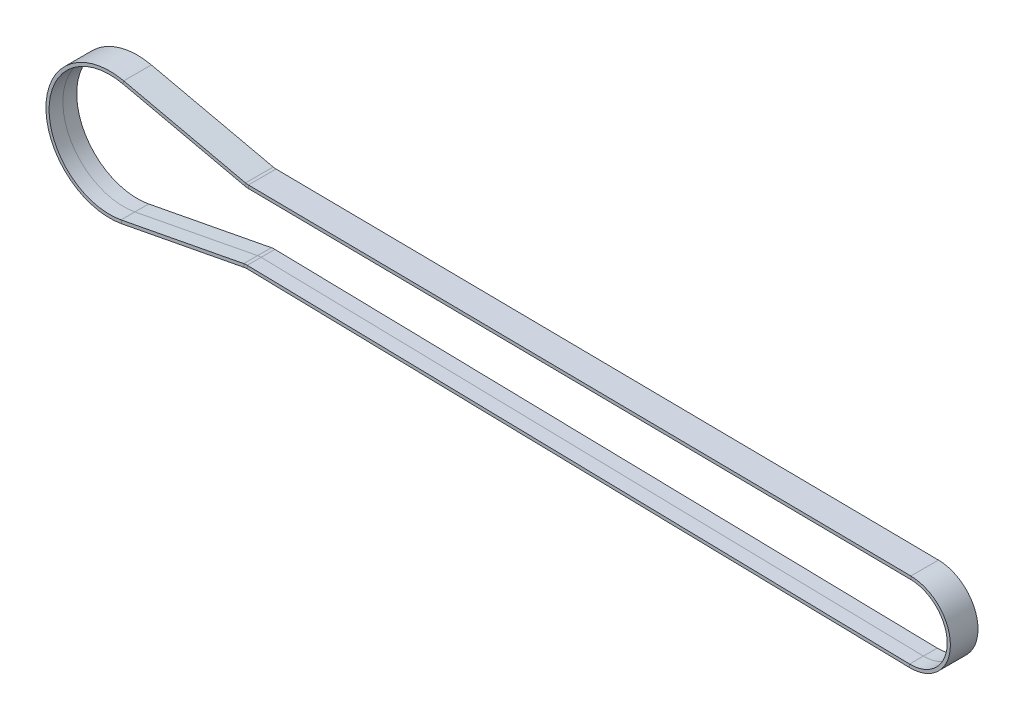
ISO-10303-21;
HEADER;
FILE_DESCRIPTION(('STEP AP214'),'2;1');
FILE_NAME('part.step','',(''),(''),'','','');
FILE_SCHEMA(('AUTOMOTIVE_DESIGN { 1 0 10303 214 1 1 1 1 }'));
ENDSEC;
DATA;
#1=APPLICATION_CONTEXT('core data for automotive mechanical design processes');
#2=APPLICATION_PROTOCOL_DEFINITION('international standard','automotive_design',2000,#1);
#3=PRODUCT_CONTEXT('',#1,'mechanical');
#4=PRODUCT('Part','Part','',(#3));
#5=PRODUCT_RELATED_PRODUCT_CATEGORY('part','',(#4));
#6=PRODUCT_DEFINITION_FORMATION('','',#4);
#7=PRODUCT_DEFINITION_CONTEXT('part definition',#1,'design');
#8=PRODUCT_DEFINITION('design','',#6,#7);
#9=PRODUCT_DEFINITION_SHAPE('','',#8);
#10=(LENGTH_UNIT() NAMED_UNIT(*) SI_UNIT(.MILLI.,.METRE.));
#11=(NAMED_UNIT(*) PLANE_ANGLE_UNIT() SI_UNIT($,.RADIAN.));
#12=(NAMED_UNIT(*) SI_UNIT($,.STERADIAN.) SOLID_ANGLE_UNIT());
#13=UNCERTAINTY_MEASURE_WITH_UNIT(LENGTH_MEASURE(1.E-05),#10,'distance_accuracy_value','');
#14=(GEOMETRIC_REPRESENTATION_CONTEXT(3) GLOBAL_UNCERTAINTY_ASSIGNED_CONTEXT((#13)) GLOBAL_UNIT_ASSIGNED_CONTEXT((#10,
#11,#12)) REPRESENTATION_CONTEXT('',''));
#15=CARTESIAN_POINT('',(0.,0.,0.));
#16=DIRECTION('',(0.,0.,1.));
#17=DIRECTION('',(1.,0.,0.));
#18=AXIS2_PLACEMENT_3D('',#15,#16,#17);
#19=CARTESIAN_POINT('',(-50.2901681021654,-17.3821457503261,0.));
#20=DIRECTION('',(0.,0.,-1.));
#21=DIRECTION('',(-1.,0.,0.));
#22=AXIS2_PLACEMENT_3D('',#19,#20,#21);
#23=CYLINDRICAL_SURFACE('',#22,21.95);
#24=DIRECTION('',(0.,0.,1.));
#25=VECTOR('',#24,1.);
#26=CARTESIAN_POINT('',(-46.1621101258883,-38.9404767929763,-5.));
#27=LINE('',#26,#25);
#28=CARTESIAN_POINT('',(-46.1621101258883,-38.9404767929763,-5.));
#29=VERTEX_POINT('',#28);
#30=CARTESIAN_POINT('',(-46.1621101258883,-38.9404767929763,0.));
#31=VERTEX_POINT('',#30);
#32=EDGE_CURVE('E242',#29,#31,#27,.T.);
#33=ORIENTED_EDGE('',*,*,#32,.F.);
#34=CARTESIAN_POINT('',(-50.2901681021654,-17.3821457503261,-5.));
#35=DIRECTION('',(0.,0.,-1.));
#36=DIRECTION('',(0.188066422609435,-0.98215631173805,0.));
#37=AXIS2_PLACEMENT_3D('',#34,#35,#36);
#38=CIRCLE('',#37,21.95);
#39=CARTESIAN_POINT('',(-45.4612239283416,4.03008902715783,-5.));
#40=VERTEX_POINT('',#39);
#41=EDGE_CURVE('E241',#29,#40,#38,.T.);
#42=ORIENTED_EDGE('',*,*,#41,.T.);
#43=DIRECTION('',(0.,0.,1.));
#44=VECTOR('',#43,1.);
#45=CARTESIAN_POINT('',(-45.4612239283416,4.03008902715783,-5.));
#46=LINE('',#45,#44);
#47=CARTESIAN_POINT('',(-45.4612239283416,4.03008902715783,0.));
#48=VERTEX_POINT('',#47);
#49=EDGE_CURVE('E216',#40,#48,#46,.T.);
#50=ORIENTED_EDGE('',*,*,#49,.T.);
#51=CARTESIAN_POINT('',(-50.2901681021654,-17.3821457503261,0.));
#52=DIRECTION('',(0.,0.,-1.));
#53=DIRECTION('',(0.188066422609435,-0.98215631173805,0.));
#54=AXIS2_PLACEMENT_3D('',#51,#52,#53);
#55=CIRCLE('',#54,21.95);
#56=EDGE_CURVE('E246',#31,#48,#55,.T.);
#57=ORIENTED_EDGE('',*,*,#56,.F.);
#58=EDGE_LOOP('',(#33,#42,#50,#57));
#59=FACE_BOUND('',#58,.T.);
#60=ADVANCED_FACE('F32',(#59),#23,.F.);
#61=CARTESIAN_POINT('',(-45.4612239283416,4.03008902715783,-5.));
#62=DIRECTION('',(0.219997456666234,0.97550044544346,0.));
#63=DIRECTION('',(-0.97550044544346,0.219997456666234,0.));
#64=AXIS2_PLACEMENT_3D('',#61,#62,#63);
#65=PLANE('',#64);
#66=DIRECTION('',(0.97550044544346,-0.219997456666234,0.));
#67=VECTOR('',#66,1.);
#68=CARTESIAN_POINT('',(-45.4612239283416,4.03008902715783,0.));
#69=LINE('',#68,#67);
#70=CARTESIAN_POINT('',(-1.33538456196405,-5.92128770384181,0.));
#71=VERTEX_POINT('',#70);
#72=EDGE_CURVE('E222',#48,#71,#69,.T.);
#73=ORIENTED_EDGE('',*,*,#72,.F.);
#74=ORIENTED_EDGE('',*,*,#49,.F.);
#75=DIRECTION('',(0.97550044544346,-0.219997456666234,0.));
#76=VECTOR('',#75,1.);
#77=CARTESIAN_POINT('',(-45.4612239283416,4.03008902715783,-5.));
#78=LINE('',#77,#76);
#79=CARTESIAN_POINT('',(-1.33538456196405,-5.92128770384181,-5.));
#80=VERTEX_POINT('',#79);
#81=EDGE_CURVE('E220',#40,#80,#78,.T.);
#82=ORIENTED_EDGE('',*,*,#81,.T.);
#83=DIRECTION('',(0.,0.,1.));
#84=VECTOR('',#83,1.);
#85=CARTESIAN_POINT('',(-1.33538456196405,-5.92128770384181,-5.));
#86=LINE('',#85,#84);
#87=EDGE_CURVE('E238',#80,#71,#86,.T.);
#88=ORIENTED_EDGE('',*,*,#87,.T.);
#89=EDGE_LOOP('',(#73,#74,#82,#88));
#90=FACE_BOUND('',#89,.T.);
#91=ADVANCED_FACE('F218',(#90),#65,.F.);
#92=CARTESIAN_POINT('',(-45.4612239283416,4.03008902715783,0.));
#93=DIRECTION('',(0.219997456666234,0.97550044544346,0.));
#94=DIRECTION('',(-0.97550044544346,0.219997456666234,0.));
#95=AXIS2_PLACEMENT_3D('',#92,#93,#94);
#96=PLANE('',#95);
#97=DIRECTION('',(0.97550044544346,-0.219997456666234,0.));
#98=VECTOR('',#97,1.);
#99=CARTESIAN_POINT('',(-45.4612239283416,4.03008902715783,5.));
#100=LINE('',#99,#98);
#101=CARTESIAN_POINT('',(-45.4612239283416,4.03008902715783,5.));
#102=VERTEX_POINT('',#101);
#103=CARTESIAN_POINT('',(-1.33538456196405,-5.92128770384181,5.));
#104=VERTEX_POINT('',#103);
#105=EDGE_CURVE('E357',#102,#104,#100,.T.);
#106=ORIENTED_EDGE('',*,*,#105,.F.);
#107=DIRECTION('',(0.,0.,1.));
#108=VECTOR('',#107,1.);
#109=CARTESIAN_POINT('',(-45.4612239283416,4.03008902715783,0.));
#110=LINE('',#109,#108);
#111=EDGE_CURVE('E227',#48,#102,#110,.T.);
#112=ORIENTED_EDGE('',*,*,#111,.F.);
#113=ORIENTED_EDGE('',*,*,#72,.T.);
#114=DIRECTION('',(0.,0.,1.));
#115=VECTOR('',#114,1.);
#116=CARTESIAN_POINT('',(-1.33538456196405,-5.92128770384181,0.));
#117=LINE('',#116,#115);
#118=EDGE_CURVE('E431',#71,#104,#117,.T.);
#119=ORIENTED_EDGE('',*,*,#118,.T.);
#120=EDGE_LOOP('',(#106,#112,#113,#119));
#121=FACE_BOUND('',#120,.T.);
#122=ADVANCED_FACE('F503',(#121),#96,.F.);
#123=CARTESIAN_POINT('',(-45.4612239283416,4.03008902715783,5.));
#124=DIRECTION('',(0.,0.,-1.));
#125=DIRECTION('',(-1.,0.,0.));
#126=AXIS2_PLACEMENT_3D('',#123,#124,#125);
#127=PLANE('',#126);
#128=DIRECTION('',(0.97550044544346,-0.219997456666234,0.));
#129=VECTOR('',#128,1.);
#130=CARTESIAN_POINT('',(-45.2104268277421,5.14215953496337,5.));
#131=LINE('',#130,#129);
#132=CARTESIAN_POINT('',(-45.2104268277421,5.14215953496337,5.));
#133=VERTEX_POINT('',#132);
#134=CARTESIAN_POINT('',(-1.08458746136455,-4.80921719603627,5.));
#135=VERTEX_POINT('',#134);
#136=EDGE_CURVE('E299',#133,#135,#131,.T.);
#137=ORIENTED_EDGE('',*,*,#136,.F.);
#138=DIRECTION('',(0.219997456666232,0.97550044544346,0.));
#139=VECTOR('',#138,1.);
#140=CARTESIAN_POINT('',(-45.4612239283416,4.03008902715783,5.));
#141=LINE('',#140,#139);
#142=EDGE_CURVE('E252',#102,#133,#141,.T.);
#143=ORIENTED_EDGE('',*,*,#142,.F.);
#144=ORIENTED_EDGE('',*,*,#105,.T.);
#145=DIRECTION('',(0.219997456666232,0.97550044544346,0.));
#146=VECTOR('',#145,1.);
#147=CARTESIAN_POINT('',(-1.33538456196405,-5.92128770384181,5.));
#148=LINE('',#147,#146);
#149=EDGE_CURVE('E355',#104,#135,#148,.T.);
#150=ORIENTED_EDGE('',*,*,#149,.T.);
#151=EDGE_LOOP('',(#137,#143,#144,#150));
#152=FACE_BOUND('',#151,.T.);
#153=ADVANCED_FACE('F510',(#152),#127,.F.);
#154=CARTESIAN_POINT('',(-45.2104268277421,5.14215953496337,5.));
#155=DIRECTION('',(-0.219997456666234,-0.97550044544346,0.));
#156=DIRECTION('',(0.97550044544346,-0.219997456666234,0.));
#157=AXIS2_PLACEMENT_3D('',#154,#155,#156);
#158=PLANE('',#157);
#159=DIRECTION('',(0.97550044544346,-0.219997456666234,0.));
#160=VECTOR('',#159,1.);
#161=CARTESIAN_POINT('',(-45.2104268277421,5.14215953496337,-5.));
#162=LINE('',#161,#160);
#163=CARTESIAN_POINT('',(-45.2104268277421,5.14215953496337,-5.));
#164=VERTEX_POINT('',#163);
#165=CARTESIAN_POINT('',(-1.08458746136455,-4.80921719603627,-5.));
#166=VERTEX_POINT('',#165);
#167=EDGE_CURVE('E258',#164,#166,#162,.T.);
#168=ORIENTED_EDGE('',*,*,#167,.F.);
#169=DIRECTION('',(0.,0.,-1.));
#170=VECTOR('',#169,1.);
#171=CARTESIAN_POINT('',(-45.2104268277421,5.14215953496337,5.));
#172=LINE('',#171,#170);
#173=EDGE_CURVE('E249',#133,#164,#172,.T.);
#174=ORIENTED_EDGE('',*,*,#173,.F.);
#175=ORIENTED_EDGE('',*,*,#136,.T.);
#176=DIRECTION('',(0.,0.,-1.));
#177=VECTOR('',#176,1.);
#178=CARTESIAN_POINT('',(-1.08458746136455,-4.80921719603627,5.));
#179=LINE('',#178,#177);
#180=EDGE_CURVE('E302',#135,#166,#179,.T.);
#181=ORIENTED_EDGE('',*,*,#180,.T.);
#182=EDGE_LOOP('',(#168,#174,#175,#181));
#183=FACE_BOUND('',#182,.T.);
#184=ADVANCED_FACE('F297',(#183),#158,.F.);
#185=CARTESIAN_POINT('',(-45.2104268277421,5.14215953496337,-5.));
#186=DIRECTION('',(0.,0.,1.));
#187=DIRECTION('',(1.,0.,0.));
#188=AXIS2_PLACEMENT_3D('',#185,#186,#187);
#189=PLANE('',#188);
#190=DIRECTION('',(-0.219997456666233,-0.97550044544346,0.));
#191=VECTOR('',#190,1.);
#192=CARTESIAN_POINT('',(-1.08458746136455,-4.80921719603627,-5.));
#193=LINE('',#192,#191);
#194=EDGE_CURVE('E236',#166,#80,#193,.T.);
#195=ORIENTED_EDGE('',*,*,#194,.T.);
#196=ORIENTED_EDGE('',*,*,#81,.F.);
#197=DIRECTION('',(-0.219997456666233,-0.97550044544346,0.));
#198=VECTOR('',#197,1.);
#199=CARTESIAN_POINT('',(-45.2104268277421,5.14215953496337,-5.));
#200=LINE('',#199,#198);
#201=EDGE_CURVE('E234',#164,#40,#200,.T.);
#202=ORIENTED_EDGE('',*,*,#201,.F.);
#203=ORIENTED_EDGE('',*,*,#167,.T.);
#204=EDGE_LOOP('',(#195,#196,#202,#203));
#205=FACE_BOUND('',#204,.T.);
#206=ADVANCED_FACE('F232',(#205),#189,.F.);
#207=CARTESIAN_POINT('',(0.,0.,0.));
#208=DIRECTION('',(0.,0.,1.));
#209=DIRECTION('',(1.,0.,0.));
#210=AXIS2_PLACEMENT_3D('',#207,#208,#209);
#211=CYLINDRICAL_SURFACE('',#210,6.06999999999999);
#212=CARTESIAN_POINT('',(0.,0.,0.));
#213=DIRECTION('',(0.,0.,1.));
#214=DIRECTION('',(-0.219997456666235,-0.97550044544346,0.));
#215=AXIS2_PLACEMENT_3D('',#212,#213,#214);
#216=CIRCLE('',#215,6.06999999999999);
#217=CARTESIAN_POINT('',(-0.0681346920493042,-6.06961758793249,0.));
#218=VERTEX_POINT('',#217);
#219=EDGE_CURVE('E438',#71,#218,#216,.T.);
#220=ORIENTED_EDGE('',*,*,#219,.F.);
#221=ORIENTED_EDGE('',*,*,#87,.F.);
#222=CARTESIAN_POINT('',(0.,0.,-5.));
#223=DIRECTION('',(0.,0.,1.));
#224=DIRECTION('',(-0.219997456666235,-0.97550044544346,0.));
#225=AXIS2_PLACEMENT_3D('',#222,#223,#224);
#226=CIRCLE('',#225,6.06999999999999);
#227=CARTESIAN_POINT('',(-0.0681346920493042,-6.06961758793249,-5.));
#228=VERTEX_POINT('',#227);
#229=EDGE_CURVE('E257',#80,#228,#226,.T.);
#230=ORIENTED_EDGE('',*,*,#229,.T.);
#231=DIRECTION('',(0.,0.,1.));
#232=VECTOR('',#231,1.);
#233=CARTESIAN_POINT('',(-0.0681346920493042,-6.0696175879325,-5.));
#234=LINE('',#233,#232);
#235=EDGE_CURVE('E450',#228,#218,#234,.T.);
#236=ORIENTED_EDGE('',*,*,#235,.T.);
#237=EDGE_LOOP('',(#220,#221,#230,#236));
#238=FACE_BOUND('',#237,.T.);
#239=ADVANCED_FACE('F453',(#238),#211,.T.);
#240=CARTESIAN_POINT('',(0.,0.,0.));
#241=DIRECTION('',(0.,0.,1.));
#242=DIRECTION('',(1.,0.,0.));
#243=AXIS2_PLACEMENT_3D('',#240,#241,#242);
#244=CYLINDRICAL_SURFACE('',#243,6.06999999999999);
#245=CARTESIAN_POINT('',(0.,0.,5.));
#246=DIRECTION('',(0.,0.,1.));
#247=DIRECTION('',(-0.219997456666235,-0.97550044544346,0.));
#248=AXIS2_PLACEMENT_3D('',#245,#246,#247);
#249=CIRCLE('',#248,6.06999999999999);
#250=CARTESIAN_POINT('',(-0.0681346920493042,-6.06961758793249,5.));
#251=VERTEX_POINT('',#250);
#252=EDGE_CURVE('E362',#104,#251,#249,.T.);
#253=ORIENTED_EDGE('',*,*,#252,.F.);
#254=ORIENTED_EDGE('',*,*,#118,.F.);
#255=ORIENTED_EDGE('',*,*,#219,.T.);
#256=DIRECTION('',(0.,0.,1.));
#257=VECTOR('',#256,1.);
#258=CARTESIAN_POINT('',(-0.0681346920493042,-6.0696175879325,0.));
#259=LINE('',#258,#257);
#260=EDGE_CURVE('E435',#218,#251,#259,.T.);
#261=ORIENTED_EDGE('',*,*,#260,.T.);
#262=EDGE_LOOP('',(#253,#254,#255,#261));
#263=FACE_BOUND('',#262,.T.);
#264=ADVANCED_FACE('F446',(#263),#244,.T.);
#265=CARTESIAN_POINT('',(-1.33538456196404,-5.92128770384181,5.));
#266=DIRECTION('',(0.,0.,-1.));
#267=DIRECTION('',(-1.,0.,0.));
#268=AXIS2_PLACEMENT_3D('',#265,#266,#267);
#269=PLANE('',#268);
#270=CARTESIAN_POINT('',(0.,0.,5.));
#271=DIRECTION('',(0.,0.,1.));
#272=DIRECTION('',(-0.219997456666235,-0.975500445443459,0.));
#273=AXIS2_PLACEMENT_3D('',#270,#271,#272);
#274=CIRCLE('',#273,4.92999999999999);
#275=CARTESIAN_POINT('',(-0.0553383907418575,-4.92968940832079,5.));
#276=VERTEX_POINT('',#275);
#277=EDGE_CURVE('E310',#135,#276,#274,.T.);
#278=ORIENTED_EDGE('',*,*,#277,.F.);
#279=ORIENTED_EDGE('',*,*,#149,.F.);
#280=ORIENTED_EDGE('',*,*,#252,.T.);
#281=DIRECTION('',(0.0112248257082859,0.999936999659388,0.));
#282=VECTOR('',#281,1.);
#283=CARTESIAN_POINT('',(-0.0681346920493042,-6.0696175879325,5.));
#284=LINE('',#283,#282);
#285=EDGE_CURVE('E359',#251,#276,#284,.T.);
#286=ORIENTED_EDGE('',*,*,#285,.T.);
#287=EDGE_LOOP('',(#278,#279,#280,#286));
#288=FACE_BOUND('',#287,.T.);
#289=ADVANCED_FACE('F443',(#288),#269,.F.);
#290=CARTESIAN_POINT('',(0.,0.,0.));
#291=DIRECTION('',(0.,0.,1.));
#292=DIRECTION('',(1.,0.,0.));
#293=AXIS2_PLACEMENT_3D('',#290,#291,#292);
#294=CYLINDRICAL_SURFACE('',#293,4.92999999999999);
#295=CARTESIAN_POINT('',(0.,0.,-5.));
#296=DIRECTION('',(0.,0.,1.));
#297=DIRECTION('',(-0.219997456666235,-0.97550044544346,0.));
#298=AXIS2_PLACEMENT_3D('',#295,#296,#297);
#299=CIRCLE('',#298,4.93);
#300=CARTESIAN_POINT('',(-0.0553383907418575,-4.92968940832079,-5.));
#301=VERTEX_POINT('',#300);
#302=EDGE_CURVE('E263',#166,#301,#299,.T.);
#303=ORIENTED_EDGE('',*,*,#302,.F.);
#304=ORIENTED_EDGE('',*,*,#180,.F.);
#305=ORIENTED_EDGE('',*,*,#277,.T.);
#306=DIRECTION('',(0.,0.,-1.));
#307=VECTOR('',#306,1.);
#308=CARTESIAN_POINT('',(-0.0553383907418575,-4.9296894083208,5.));
#309=LINE('',#308,#307);
#310=EDGE_CURVE('E307',#276,#301,#309,.T.);
#311=ORIENTED_EDGE('',*,*,#310,.T.);
#312=EDGE_LOOP('',(#303,#304,#305,#311));
#313=FACE_BOUND('',#312,.T.);
#314=ADVANCED_FACE('F571',(#313),#294,.F.);
#315=CARTESIAN_POINT('',(-1.08458746136453,-4.80921719603626,-5.));
#316=DIRECTION('',(0.,0.,1.));
#317=DIRECTION('',(1.,0.,0.));
#318=AXIS2_PLACEMENT_3D('',#315,#316,#317);
#319=PLANE('',#318);
#320=DIRECTION('',(-0.0112248257082863,-0.999936999659388,0.));
#321=VECTOR('',#320,1.);
#322=CARTESIAN_POINT('',(-0.0553383907418575,-4.9296894083208,-5.));
#323=LINE('',#322,#321);
#324=EDGE_CURVE('E259',#301,#228,#323,.T.);
#325=ORIENTED_EDGE('',*,*,#324,.T.);
#326=ORIENTED_EDGE('',*,*,#229,.F.);
#327=ORIENTED_EDGE('',*,*,#194,.F.);
#328=ORIENTED_EDGE('',*,*,#302,.T.);
#329=EDGE_LOOP('',(#325,#326,#327,#328));
#330=FACE_BOUND('',#329,.T.);
#331=ADVANCED_FACE('F569',(#330),#319,.F.);
#332=CARTESIAN_POINT('',(-0.0681346920493042,-6.0696175879325,-5.));
#333=DIRECTION('',(0.0112248257082868,0.999936999659388,0.));
#334=DIRECTION('',(-0.999936999659388,0.0112248257082868,0.));
#335=AXIS2_PLACEMENT_3D('',#332,#333,#334);
#336=PLANE('',#335);
#337=DIRECTION('',(0.999936999659388,-0.0112248257082868,0.));
#338=VECTOR('',#337,1.);
#339=CARTESIAN_POINT('',(-0.0681346920493042,-6.0696175879325,0.));
#340=LINE('',#339,#338);
#341=CARTESIAN_POINT('',(239.821114693586,-8.76250225422921,0.));
#342=VERTEX_POINT('',#341);
#343=EDGE_CURVE('E404',#218,#342,#340,.T.);
#344=ORIENTED_EDGE('',*,*,#343,.F.);
#345=ORIENTED_EDGE('',*,*,#235,.F.);
#346=DIRECTION('',(0.999936999659388,-0.0112248257082868,0.));
#347=VECTOR('',#346,1.);
#348=CARTESIAN_POINT('',(-0.0681346920493042,-6.0696175879325,-5.));
#349=LINE('',#348,#347);
#350=CARTESIAN_POINT('',(239.821114693586,-8.76250225422921,-5.));
#351=VERTEX_POINT('',#350);
#352=EDGE_CURVE('E262',#228,#351,#349,.T.);
#353=ORIENTED_EDGE('',*,*,#352,.T.);
#354=DIRECTION('',(0.,0.,1.));
#355=VECTOR('',#354,1.);
#356=CARTESIAN_POINT('',(239.821114693586,-8.76250225422921,-5.));
#357=LINE('',#356,#355);
#358=EDGE_CURVE('E458',#351,#342,#357,.T.);
#359=ORIENTED_EDGE('',*,*,#358,.T.);
#360=EDGE_LOOP('',(#344,#345,#353,#359));
#361=FACE_BOUND('',#360,.T.);
#362=ADVANCED_FACE('F456',(#361),#336,.F.);
#363=CARTESIAN_POINT('',(-0.0681346920493042,-6.0696175879325,0.));
#364=DIRECTION('',(0.0112248257082868,0.999936999659388,0.));
#365=DIRECTION('',(-0.999936999659388,0.0112248257082868,0.));
#366=AXIS2_PLACEMENT_3D('',#363,#364,#365);
#367=PLANE('',#366);
#368=DIRECTION('',(0.999936999659388,-0.0112248257082868,0.));
#369=VECTOR('',#368,1.);
#370=CARTESIAN_POINT('',(-0.0681346920493042,-6.0696175879325,5.));
#371=LINE('',#370,#369);
#372=CARTESIAN_POINT('',(239.821114693586,-8.76250225422921,5.));
#373=VERTEX_POINT('',#372);
#374=EDGE_CURVE('E367',#251,#373,#371,.T.);
#375=ORIENTED_EDGE('',*,*,#374,.F.);
#376=ORIENTED_EDGE('',*,*,#260,.F.);
#377=ORIENTED_EDGE('',*,*,#343,.T.);
#378=DIRECTION('',(0.,0.,1.));
#379=VECTOR('',#378,1.);
#380=CARTESIAN_POINT('',(239.821114693586,-8.76250225422921,0.));
#381=LINE('',#380,#379);
#382=EDGE_CURVE('E400',#342,#373,#381,.T.);
#383=ORIENTED_EDGE('',*,*,#382,.T.);
#384=EDGE_LOOP('',(#375,#376,#377,#383));
#385=FACE_BOUND('',#384,.T.);
#386=ADVANCED_FACE('F402',(#385),#367,.F.);
#387=CARTESIAN_POINT('',(-0.0681346920493042,-6.0696175879325,5.));
#388=DIRECTION('',(0.,0.,-1.));
#389=DIRECTION('',(-1.,0.,0.));
#390=AXIS2_PLACEMENT_3D('',#387,#388,#389);
#391=PLANE('',#390);
#392=DIRECTION('',(0.999936999659388,-0.0112248257082868,0.));
#393=VECTOR('',#392,1.);
#394=CARTESIAN_POINT('',(-0.0553383907418645,-4.9296894083208,5.));
#395=LINE('',#394,#393);
#396=CARTESIAN_POINT('',(239.833910994893,-7.62257407461751,5.));
#397=VERTEX_POINT('',#396);
#398=EDGE_CURVE('E315',#276,#397,#395,.T.);
#399=ORIENTED_EDGE('',*,*,#398,.F.);
#400=ORIENTED_EDGE('',*,*,#285,.F.);
#401=ORIENTED_EDGE('',*,*,#374,.T.);
#402=DIRECTION('',(0.0112248257082854,0.999936999659388,0.));
#403=VECTOR('',#402,1.);
#404=CARTESIAN_POINT('',(239.821114693586,-8.76250225422921,5.));
#405=LINE('',#404,#403);
#406=EDGE_CURVE('E364',#373,#397,#405,.T.);
#407=ORIENTED_EDGE('',*,*,#406,.T.);
#408=EDGE_LOOP('',(#399,#400,#401,#407));
#409=FACE_BOUND('',#408,.T.);
#410=ADVANCED_FACE('F395',(#409),#391,.F.);
#411=CARTESIAN_POINT('',(-0.0553383907418645,-4.9296894083208,5.));
#412=DIRECTION('',(-0.0112248257082868,-0.999936999659388,0.));
#413=DIRECTION('',(0.999936999659388,-0.0112248257082868,0.));
#414=AXIS2_PLACEMENT_3D('',#411,#412,#413);
#415=PLANE('',#414);
#416=DIRECTION('',(0.999936999659388,-0.0112248257082868,0.));
#417=VECTOR('',#416,1.);
#418=CARTESIAN_POINT('',(-0.0553383907418645,-4.9296894083208,-5.));
#419=LINE('',#418,#417);
#420=CARTESIAN_POINT('',(239.833910994893,-7.62257407461751,-5.));
#421=VERTEX_POINT('',#420);
#422=EDGE_CURVE('E268',#301,#421,#419,.T.);
#423=ORIENTED_EDGE('',*,*,#422,.F.);
#424=ORIENTED_EDGE('',*,*,#310,.F.);
#425=ORIENTED_EDGE('',*,*,#398,.T.);
#426=DIRECTION('',(0.,0.,-1.));
#427=VECTOR('',#426,1.);
#428=CARTESIAN_POINT('',(239.833910994893,-7.62257407461751,5.));
#429=LINE('',#428,#427);
#430=EDGE_CURVE('E312',#397,#421,#429,.T.);
#431=ORIENTED_EDGE('',*,*,#430,.T.);
#432=EDGE_LOOP('',(#423,#424,#425,#431));
#433=FACE_BOUND('',#432,.T.);
#434=ADVANCED_FACE('F391',(#433),#415,.F.);
#435=CARTESIAN_POINT('',(-0.0553383907418645,-4.9296894083208,-5.));
#436=DIRECTION('',(0.,0.,1.));
#437=DIRECTION('',(1.,0.,0.));
#438=AXIS2_PLACEMENT_3D('',#435,#436,#437);
#439=PLANE('',#438);
#440=DIRECTION('',(-0.0112248257082857,-0.999936999659388,0.));
#441=VECTOR('',#440,1.);
#442=CARTESIAN_POINT('',(239.833910994893,-7.62257407461751,-5.));
#443=LINE('',#442,#441);
#444=EDGE_CURVE('E264',#421,#351,#443,.T.);
#445=ORIENTED_EDGE('',*,*,#444,.T.);
#446=ORIENTED_EDGE('',*,*,#352,.F.);
#447=ORIENTED_EDGE('',*,*,#324,.F.);
#448=ORIENTED_EDGE('',*,*,#422,.T.);
#449=EDGE_LOOP('',(#445,#446,#447,#448));
#450=FACE_BOUND('',#449,.T.);
#451=ADVANCED_FACE('F386',(#450),#439,.F.);
#452=CARTESIAN_POINT('',(239.67126327038,-22.111661199682,0.));
#453=DIRECTION('',(0.,0.,-1.));
#454=DIRECTION('',(-1.,0.,0.));
#455=AXIS2_PLACEMENT_3D('',#452,#453,#454);
#456=CYLINDRICAL_SURFACE('',#455,13.35);
#457=CARTESIAN_POINT('',(239.67126327038,-22.111661199682,0.));
#458=DIRECTION('',(0.,0.,-1.));
#459=DIRECTION('',(0.0112248257082838,0.999936999659388,0.));
#460=AXIS2_PLACEMENT_3D('',#457,#458,#459);
#461=CIRCLE('',#460,13.35);
#462=CARTESIAN_POINT('',(239.385678731128,-35.4586062235795,0.));
#463=VERTEX_POINT('',#462);
#464=EDGE_CURVE('E193',#342,#463,#461,.T.);
#465=ORIENTED_EDGE('',*,*,#464,.F.);
#466=ORIENTED_EDGE('',*,*,#358,.F.);
#467=CARTESIAN_POINT('',(239.67126327038,-22.111661199682,-5.));
#468=DIRECTION('',(0.,0.,-1.));
#469=DIRECTION('',(0.0112248257082838,0.999936999659388,0.));
#470=AXIS2_PLACEMENT_3D('',#467,#468,#469);
#471=CIRCLE('',#470,13.35);
#472=CARTESIAN_POINT('',(239.385678731128,-35.4586062235795,-5.));
#473=VERTEX_POINT('',#472);
#474=EDGE_CURVE('E267',#351,#473,#471,.T.);
#475=ORIENTED_EDGE('',*,*,#474,.T.);
#476=DIRECTION('',(0.,0.,1.));
#477=VECTOR('',#476,1.);
#478=CARTESIAN_POINT('',(239.385678731128,-35.4586062235795,-5.));
#479=LINE('',#478,#477);
#480=EDGE_CURVE('E464',#473,#463,#479,.T.);
#481=ORIENTED_EDGE('',*,*,#480,.T.);
#482=EDGE_LOOP('',(#465,#466,#475,#481));
#483=FACE_BOUND('',#482,.T.);
#484=ADVANCED_FACE('F516',(#483),#456,.F.);
#485=CARTESIAN_POINT('',(239.67126327038,-22.111661199682,0.));
#486=DIRECTION('',(0.,0.,-1.));
#487=DIRECTION('',(-1.,0.,0.));
#488=AXIS2_PLACEMENT_3D('',#485,#486,#487);
#489=CYLINDRICAL_SURFACE('',#488,13.35);
#490=CARTESIAN_POINT('',(239.67126327038,-22.111661199682,5.));
#491=DIRECTION('',(0.,0.,-1.));
#492=DIRECTION('',(0.0112248257082838,0.999936999659388,0.));
#493=AXIS2_PLACEMENT_3D('',#490,#491,#492);
#494=CIRCLE('',#493,13.35);
#495=CARTESIAN_POINT('',(239.385678731128,-35.4586062235795,5.));
#496=VERTEX_POINT('',#495);
#497=EDGE_CURVE('E187',#373,#496,#494,.T.);
#498=ORIENTED_EDGE('',*,*,#497,.F.);
#499=ORIENTED_EDGE('',*,*,#382,.F.);
#500=ORIENTED_EDGE('',*,*,#464,.T.);
#501=DIRECTION('',(0.,0.,1.));
#502=VECTOR('',#501,1.);
#503=CARTESIAN_POINT('',(239.385678731128,-35.4586062235795,0.));
#504=LINE('',#503,#502);
#505=EDGE_CURVE('E408',#463,#496,#504,.T.);
#506=ORIENTED_EDGE('',*,*,#505,.T.);
#507=EDGE_LOOP('',(#498,#499,#500,#506));
#508=FACE_BOUND('',#507,.T.);
#509=ADVANCED_FACE('F407',(#508),#489,.F.);
#510=CARTESIAN_POINT('',(239.821114693586,-8.76250225422921,5.));
#511=DIRECTION('',(0.,0.,-1.));
#512=DIRECTION('',(-1.,0.,0.));
#513=AXIS2_PLACEMENT_3D('',#510,#511,#512);
#514=PLANE('',#513);
#515=CARTESIAN_POINT('',(239.67126327038,-22.111661199682,5.));
#516=DIRECTION('',(0.,0.,-1.));
#517=DIRECTION('',(0.0112248257082849,0.999936999659388,0.));
#518=AXIS2_PLACEMENT_3D('',#515,#516,#517);
#519=CIRCLE('',#518,14.49);
#520=CARTESIAN_POINT('',(239.361291736765,-36.5983453492156,5.));
#521=VERTEX_POINT('',#520);
#522=EDGE_CURVE('E320',#397,#521,#519,.T.);
#523=ORIENTED_EDGE('',*,*,#522,.F.);
#524=ORIENTED_EDGE('',*,*,#406,.F.);
#525=ORIENTED_EDGE('',*,*,#497,.T.);
#526=DIRECTION('',(-0.0213921003185345,-0.999771162838758,0.));
#527=VECTOR('',#526,1.);
#528=CARTESIAN_POINT('',(239.385678731128,-35.4586062235795,5.));
#529=LINE('',#528,#527);
#530=EDGE_CURVE('E369',#496,#521,#529,.T.);
#531=ORIENTED_EDGE('',*,*,#530,.T.);
#532=EDGE_LOOP('',(#523,#524,#525,#531));
#533=FACE_BOUND('',#532,.T.);
#534=ADVANCED_FACE('F375',(#533),#514,.F.);
#535=CARTESIAN_POINT('',(239.67126327038,-22.111661199682,0.));
#536=DIRECTION('',(0.,0.,-1.));
#537=DIRECTION('',(-1.,0.,0.));
#538=AXIS2_PLACEMENT_3D('',#535,#536,#537);
#539=CYLINDRICAL_SURFACE('',#538,14.49);
#540=CARTESIAN_POINT('',(239.67126327038,-22.111661199682,-5.));
#541=DIRECTION('',(0.,0.,-1.));
#542=DIRECTION('',(0.0112248257082849,0.999936999659388,0.));
#543=AXIS2_PLACEMENT_3D('',#540,#541,#542);
#544=CIRCLE('',#543,14.49);
#545=CARTESIAN_POINT('',(239.361291736765,-36.5983453492156,-5.));
#546=VERTEX_POINT('',#545);
#547=EDGE_CURVE('E273',#421,#546,#544,.T.);
#548=ORIENTED_EDGE('',*,*,#547,.F.);
#549=ORIENTED_EDGE('',*,*,#430,.F.);
#550=ORIENTED_EDGE('',*,*,#522,.T.);
#551=DIRECTION('',(0.,0.,-1.));
#552=VECTOR('',#551,1.);
#553=CARTESIAN_POINT('',(239.361291736765,-36.5983453492156,5.));
#554=LINE('',#553,#552);
#555=EDGE_CURVE('E317',#521,#546,#554,.T.);
#556=ORIENTED_EDGE('',*,*,#555,.T.);
#557=EDGE_LOOP('',(#548,#549,#550,#556));
#558=FACE_BOUND('',#557,.T.);
#559=ADVANCED_FACE('F374',(#558),#539,.T.);
#560=CARTESIAN_POINT('',(239.833910994893,-7.62257407461751,-5.));
#561=DIRECTION('',(0.,0.,1.));
#562=DIRECTION('',(1.,0.,0.));
#563=AXIS2_PLACEMENT_3D('',#560,#561,#562);
#564=PLANE('',#563);
#565=DIRECTION('',(0.0213921003185348,0.999771162838758,0.));
#566=VECTOR('',#565,1.);
#567=CARTESIAN_POINT('',(239.361291736765,-36.5983453492156,-5.));
#568=LINE('',#567,#566);
#569=EDGE_CURVE('E269',#546,#473,#568,.T.);
#570=ORIENTED_EDGE('',*,*,#569,.T.);
#571=ORIENTED_EDGE('',*,*,#474,.F.);
#572=ORIENTED_EDGE('',*,*,#444,.F.);
#573=ORIENTED_EDGE('',*,*,#547,.T.);
#574=EDGE_LOOP('',(#570,#571,#572,#573));
#575=FACE_BOUND('',#574,.T.);
#576=ADVANCED_FACE('F382',(#575),#564,.F.);
#577=CARTESIAN_POINT('',(239.385678731128,-35.4586062235795,-5.));
#578=DIRECTION('',(-0.021392100318535,-0.999771162838758,0.));
#579=DIRECTION('',(0.999771162838758,-0.021392100318535,0.));
#580=AXIS2_PLACEMENT_3D('',#577,#578,#579);
#581=PLANE('',#580);
#582=DIRECTION('',(-0.999771162838758,0.021392100318535,0.));
#583=VECTOR('',#582,1.);
#584=CARTESIAN_POINT('',(239.385678731128,-35.4586062235795,0.));
#585=LINE('',#584,#583);
#586=CARTESIAN_POINT('',(-0.463785683331025,-30.3265480138464,0.));
#587=VERTEX_POINT('',#586);
#588=EDGE_CURVE('E160',#463,#587,#585,.T.);
#589=ORIENTED_EDGE('',*,*,#588,.F.);
#590=ORIENTED_EDGE('',*,*,#480,.F.);
#591=DIRECTION('',(-0.999771162838758,0.021392100318535,0.));
#592=VECTOR('',#591,1.);
#593=CARTESIAN_POINT('',(239.385678731128,-35.4586062235795,-5.));
#594=LINE('',#593,#592);
#595=CARTESIAN_POINT('',(-0.463785683331025,-30.3265480138464,-5.));
#596=VERTEX_POINT('',#595);
#597=EDGE_CURVE('E272',#473,#596,#594,.T.);
#598=ORIENTED_EDGE('',*,*,#597,.T.);
#599=DIRECTION('',(0.,0.,1.));
#600=VECTOR('',#599,1.);
#601=CARTESIAN_POINT('',(-0.463785683330907,-30.3265480138464,-5.));
#602=LINE('',#601,#600);
#603=EDGE_CURVE('E324',#596,#587,#602,.T.);
#604=ORIENTED_EDGE('',*,*,#603,.T.);
#605=EDGE_LOOP('',(#589,#590,#598,#604));
#606=FACE_BOUND('',#605,.T.);
#607=ADVANCED_FACE('F487',(#606),#581,.F.);
#608=CARTESIAN_POINT('',(239.385678731128,-35.4586062235795,0.));
#609=DIRECTION('',(-0.021392100318535,-0.999771162838758,0.));
#610=DIRECTION('',(0.999771162838758,-0.021392100318535,0.));
#611=AXIS2_PLACEMENT_3D('',#608,#609,#610);
#612=PLANE('',#611);
#613=DIRECTION('',(-0.999771162838758,0.021392100318535,0.));
#614=VECTOR('',#613,1.);
#615=CARTESIAN_POINT('',(239.385678731128,-35.4586062235795,5.));
#616=LINE('',#615,#614);
#617=CARTESIAN_POINT('',(-0.463785683331025,-30.3265480138464,5.));
#618=VERTEX_POINT('',#617);
#619=EDGE_CURVE('E153',#496,#618,#616,.T.);
#620=ORIENTED_EDGE('',*,*,#619,.F.);
#621=ORIENTED_EDGE('',*,*,#505,.F.);
#622=ORIENTED_EDGE('',*,*,#588,.T.);
#623=DIRECTION('',(0.,0.,1.));
#624=VECTOR('',#623,1.);
#625=CARTESIAN_POINT('',(-0.463785683330907,-30.3265480138464,0.));
#626=LINE('',#625,#624);
#627=EDGE_CURVE('E328',#587,#618,#626,.T.);
#628=ORIENTED_EDGE('',*,*,#627,.T.);
#629=EDGE_LOOP('',(#620,#621,#622,#628));
#630=FACE_BOUND('',#629,.T.);
#631=ADVANCED_FACE('F485',(#630),#612,.F.);
#632=CARTESIAN_POINT('',(239.385678731128,-35.4586062235795,5.));
#633=DIRECTION('',(0.,0.,-1.));
#634=DIRECTION('',(-1.,0.,0.));
#635=AXIS2_PLACEMENT_3D('',#632,#633,#634);
#636=PLANE('',#635);
#637=DIRECTION('',(-0.999771162838758,0.021392100318535,0.));
#638=VECTOR('',#637,1.);
#639=CARTESIAN_POINT('',(239.361291736765,-36.5983453492156,5.));
#640=LINE('',#639,#638);
#641=CARTESIAN_POINT('',(-0.48817267769416,-31.4662871394826,5.));
#642=VERTEX_POINT('',#641);
#643=EDGE_CURVE('E146',#521,#642,#640,.T.);
#644=ORIENTED_EDGE('',*,*,#643,.F.);
#645=ORIENTED_EDGE('',*,*,#530,.F.);
#646=ORIENTED_EDGE('',*,*,#619,.T.);
#647=DIRECTION('',(-0.0213921003185336,-0.999771162838758,0.));
#648=VECTOR('',#647,1.);
#649=CARTESIAN_POINT('',(-0.463785683330907,-30.3265480138464,5.));
#650=LINE('',#649,#648);
#651=EDGE_CURVE('E322',#618,#642,#650,.T.);
#652=ORIENTED_EDGE('',*,*,#651,.T.);
#653=EDGE_LOOP('',(#644,#645,#646,#652));
#654=FACE_BOUND('',#653,.T.);
#655=ADVANCED_FACE('F376',(#654),#636,.F.);
#656=CARTESIAN_POINT('',(239.361291736765,-36.5983453492156,5.));
#657=DIRECTION('',(0.021392100318535,0.999771162838758,0.));
#658=DIRECTION('',(-0.999771162838758,0.021392100318535,0.));
#659=AXIS2_PLACEMENT_3D('',#656,#657,#658);
#660=PLANE('',#659);
#661=DIRECTION('',(-0.999771162838758,0.021392100318535,0.));
#662=VECTOR('',#661,1.);
#663=CARTESIAN_POINT('',(239.361291736765,-36.5983453492156,-5.));
#664=LINE('',#663,#662);
#665=CARTESIAN_POINT('',(-0.48817267769416,-31.4662871394826,-5.));
#666=VERTEX_POINT('',#665);
#667=EDGE_CURVE('E323',#546,#666,#664,.T.);
#668=ORIENTED_EDGE('',*,*,#667,.F.);
#669=ORIENTED_EDGE('',*,*,#555,.F.);
#670=ORIENTED_EDGE('',*,*,#643,.T.);
#671=DIRECTION('',(0.,0.,-1.));
#672=VECTOR('',#671,1.);
#673=CARTESIAN_POINT('',(-0.488172677694042,-31.4662871394826,5.));
#674=LINE('',#673,#672);
#675=EDGE_CURVE('E277',#642,#666,#674,.T.);
#676=ORIENTED_EDGE('',*,*,#675,.T.);
#677=EDGE_LOOP('',(#668,#669,#670,#676));
#678=FACE_BOUND('',#677,.T.);
#679=ADVANCED_FACE('F377',(#678),#660,.F.);
#680=CARTESIAN_POINT('',(239.361291736765,-36.5983453492156,-5.));
#681=DIRECTION('',(0.,0.,1.));
#682=DIRECTION('',(1.,0.,0.));
#683=AXIS2_PLACEMENT_3D('',#680,#681,#682);
#684=PLANE('',#683);
#685=DIRECTION('',(0.0213921003185339,0.999771162838758,0.));
#686=VECTOR('',#685,1.);
#687=CARTESIAN_POINT('',(-0.488172677694042,-31.4662871394826,-5.));
#688=LINE('',#687,#686);
#689=EDGE_CURVE('E274',#666,#596,#688,.T.);
#690=ORIENTED_EDGE('',*,*,#689,.T.);
#691=ORIENTED_EDGE('',*,*,#597,.F.);
#692=ORIENTED_EDGE('',*,*,#569,.F.);
#693=ORIENTED_EDGE('',*,*,#667,.T.);
#694=EDGE_LOOP('',(#690,#691,#692,#693));
#695=FACE_BOUND('',#694,.T.);
#696=ADVANCED_FACE('F379',(#695),#684,.F.);
#697=CARTESIAN_POINT('',(-0.593635732264314,-36.3951589722777,0.));
#698=DIRECTION('',(0.,0.,1.));
#699=DIRECTION('',(1.,0.,0.));
#700=AXIS2_PLACEMENT_3D('',#697,#698,#699);
#701=CYLINDRICAL_SURFACE('',#700,6.07);
#702=CARTESIAN_POINT('',(-0.593635732264314,-36.3951589722777,0.));
#703=DIRECTION('',(0.,0.,1.));
#704=DIRECTION('',(0.0213921003185367,0.999771162838758,0.));
#705=AXIS2_PLACEMENT_3D('',#702,#703,#704);
#706=CIRCLE('',#705,6.07);
#707=CARTESIAN_POINT('',(-1.73519891750357,-30.4334701600277,0.));
#708=VERTEX_POINT('',#707);
#709=EDGE_CURVE('E415',#587,#708,#706,.T.);
#710=ORIENTED_EDGE('',*,*,#709,.F.);
#711=ORIENTED_EDGE('',*,*,#603,.F.);
#712=CARTESIAN_POINT('',(-0.593635732264314,-36.3951589722777,-5.));
#713=DIRECTION('',(0.,0.,1.));
#714=DIRECTION('',(0.0213921003185367,0.999771162838758,0.));
#715=AXIS2_PLACEMENT_3D('',#712,#713,#714);
#716=CIRCLE('',#715,6.07);
#717=CARTESIAN_POINT('',(-1.73519891750357,-30.4334701600277,-5.));
#718=VERTEX_POINT('',#717);
#719=EDGE_CURVE('E276',#596,#718,#716,.T.);
#720=ORIENTED_EDGE('',*,*,#719,.T.);
#721=DIRECTION('',(0.,0.,1.));
#722=VECTOR('',#721,1.);
#723=CARTESIAN_POINT('',(-1.73519891750357,-30.4334701600277,-5.));
#724=LINE('',#723,#722);
#725=EDGE_CURVE('E470',#718,#708,#724,.T.);
#726=ORIENTED_EDGE('',*,*,#725,.T.);
#727=EDGE_LOOP('',(#710,#711,#720,#726));
#728=FACE_BOUND('',#727,.T.);
#729=ADVANCED_FACE('F477',(#728),#701,.T.);
#730=CARTESIAN_POINT('',(-0.593635732264314,-36.3951589722777,0.));
#731=DIRECTION('',(0.,0.,1.));
#732=DIRECTION('',(1.,0.,0.));
#733=AXIS2_PLACEMENT_3D('',#730,#731,#732);
#734=CYLINDRICAL_SURFACE('',#733,6.07);
#735=CARTESIAN_POINT('',(-0.593635732264314,-36.3951589722777,5.));
#736=DIRECTION('',(0.,0.,1.));
#737=DIRECTION('',(0.0213921003185367,0.999771162838758,0.));
#738=AXIS2_PLACEMENT_3D('',#735,#736,#737);
#739=CIRCLE('',#738,6.07);
#740=CARTESIAN_POINT('',(-1.73519891750357,-30.4334701600277,5.));
#741=VERTEX_POINT('',#740);
#742=EDGE_CURVE('E119',#618,#741,#739,.T.);
#743=ORIENTED_EDGE('',*,*,#742,.F.);
#744=ORIENTED_EDGE('',*,*,#627,.F.);
#745=ORIENTED_EDGE('',*,*,#709,.T.);
#746=DIRECTION('',(0.,0.,1.));
#747=VECTOR('',#746,1.);
#748=CARTESIAN_POINT('',(-1.73519891750357,-30.4334701600277,0.));
#749=LINE('',#748,#747);
#750=EDGE_CURVE('E413',#708,#741,#749,.T.);
#751=ORIENTED_EDGE('',*,*,#750,.T.);
#752=EDGE_LOOP('',(#743,#744,#745,#751));
#753=FACE_BOUND('',#752,.T.);
#754=ADVANCED_FACE('F483',(#753),#734,.T.);
#755=CARTESIAN_POINT('',(-0.463785683330796,-30.3265480138464,5.));
#756=DIRECTION('',(0.,0.,-1.));
#757=DIRECTION('',(-1.,0.,0.));
#758=AXIS2_PLACEMENT_3D('',#755,#756,#757);
#759=PLANE('',#758);
#760=CARTESIAN_POINT('',(-0.593635732264314,-36.3951589722777,5.));
#761=DIRECTION('',(0.,0.,1.));
#762=DIRECTION('',(0.0213921003185361,0.999771162838758,0.));
#763=AXIS2_PLACEMENT_3D('',#760,#761,#762);
#764=CIRCLE('',#763,4.93);
#765=CARTESIAN_POINT('',(-1.52080319572881,-31.5531283554091,5.));
#766=VERTEX_POINT('',#765);
#767=EDGE_CURVE('E111',#642,#766,#764,.T.);
#768=ORIENTED_EDGE('',*,*,#767,.F.);
#769=ORIENTED_EDGE('',*,*,#651,.F.);
#770=ORIENTED_EDGE('',*,*,#742,.T.);
#771=DIRECTION('',(0.188066422609436,-0.98215631173805,0.));
#772=VECTOR('',#771,1.);
#773=CARTESIAN_POINT('',(-1.73519891750357,-30.4334701600277,5.));
#774=LINE('',#773,#772);
#775=EDGE_CURVE('E335',#741,#766,#774,.T.);
#776=ORIENTED_EDGE('',*,*,#775,.T.);
#777=EDGE_LOOP('',(#768,#769,#770,#776));
#778=FACE_BOUND('',#777,.T.);
#779=ADVANCED_FACE('F535',(#778),#759,.F.);
#780=CARTESIAN_POINT('',(-0.593635732264314,-36.3951589722777,0.));
#781=DIRECTION('',(0.,0.,1.));
#782=DIRECTION('',(1.,0.,0.));
#783=AXIS2_PLACEMENT_3D('',#780,#781,#782);
#784=CYLINDRICAL_SURFACE('',#783,4.93);
#785=CARTESIAN_POINT('',(-0.593635732264314,-36.3951589722777,-5.));
#786=DIRECTION('',(0.,0.,1.));
#787=DIRECTION('',(0.0213921003185361,0.999771162838758,0.));
#788=AXIS2_PLACEMENT_3D('',#785,#786,#787);
#789=CIRCLE('',#788,4.93);
#790=CARTESIAN_POINT('',(-1.52080319572881,-31.5531283554091,-5.));
#791=VERTEX_POINT('',#790);
#792=EDGE_CURVE('E102',#666,#791,#789,.T.);
#793=ORIENTED_EDGE('',*,*,#792,.F.);
#794=ORIENTED_EDGE('',*,*,#675,.F.);
#795=ORIENTED_EDGE('',*,*,#767,.T.);
#796=DIRECTION('',(0.,0.,-1.));
#797=VECTOR('',#796,1.);
#798=CARTESIAN_POINT('',(-1.52080319572881,-31.5531283554091,5.));
#799=LINE('',#798,#797);
#800=EDGE_CURVE('E283',#766,#791,#799,.T.);
#801=ORIENTED_EDGE('',*,*,#800,.T.);
#802=EDGE_LOOP('',(#793,#794,#795,#801));
#803=FACE_BOUND('',#802,.T.);
#804=ADVANCED_FACE('F545',(#803),#784,.F.);
#805=CARTESIAN_POINT('',(-0.488172677693931,-31.4662871394826,-5.));
#806=DIRECTION('',(0.,0.,1.));
#807=DIRECTION('',(1.,0.,0.));
#808=AXIS2_PLACEMENT_3D('',#805,#806,#807);
#809=PLANE('',#808);
#810=DIRECTION('',(-0.188066422609436,0.98215631173805,0.));
#811=VECTOR('',#810,1.);
#812=CARTESIAN_POINT('',(-1.52080319572881,-31.5531283554091,-5.));
#813=LINE('',#812,#811);
#814=EDGE_CURVE('E278',#791,#718,#813,.T.);
#815=ORIENTED_EDGE('',*,*,#814,.T.);
#816=ORIENTED_EDGE('',*,*,#719,.F.);
#817=ORIENTED_EDGE('',*,*,#689,.F.);
#818=ORIENTED_EDGE('',*,*,#792,.T.);
#819=EDGE_LOOP('',(#815,#816,#817,#818));
#820=FACE_BOUND('',#819,.T.);
#821=ADVANCED_FACE('F543',(#820),#809,.F.);
#822=CARTESIAN_POINT('',(-1.73519891750357,-30.4334701600277,-5.));
#823=DIRECTION('',(0.188066422609435,-0.98215631173805,0.));
#824=DIRECTION('',(0.98215631173805,0.188066422609435,0.));
#825=AXIS2_PLACEMENT_3D('',#822,#823,#824);
#826=PLANE('',#825);
#827=DIRECTION('',(-0.98215631173805,-0.188066422609435,0.));
#828=VECTOR('',#827,1.);
#829=CARTESIAN_POINT('',(-1.73519891750357,-30.4334701600277,0.));
#830=LINE('',#829,#828);
#831=EDGE_CURVE('E418',#708,#31,#830,.T.);
#832=ORIENTED_EDGE('',*,*,#831,.F.);
#833=ORIENTED_EDGE('',*,*,#725,.F.);
#834=DIRECTION('',(-0.98215631173805,-0.188066422609435,0.));
#835=VECTOR('',#834,1.);
#836=CARTESIAN_POINT('',(-1.73519891750357,-30.4334701600277,-5.));
#837=LINE('',#836,#835);
#838=EDGE_CURVE('E279',#718,#29,#837,.T.);
#839=ORIENTED_EDGE('',*,*,#838,.T.);
#840=ORIENTED_EDGE('',*,*,#32,.T.);
#841=EDGE_LOOP('',(#832,#833,#839,#840));
#842=FACE_BOUND('',#841,.T.);
#843=ADVANCED_FACE('F479',(#842),#826,.F.);
#844=CARTESIAN_POINT('',(-1.73519891750357,-30.4334701600277,0.));
#845=DIRECTION('',(0.188066422609435,-0.98215631173805,0.));
#846=DIRECTION('',(0.98215631173805,0.188066422609435,0.));
#847=AXIS2_PLACEMENT_3D('',#844,#845,#846);
#848=PLANE('',#847);
#849=DIRECTION('',(-0.98215631173805,-0.188066422609435,0.));
#850=VECTOR('',#849,1.);
#851=CARTESIAN_POINT('',(-1.73519891750357,-30.4334701600277,5.));
#852=LINE('',#851,#850);
#853=CARTESIAN_POINT('',(-46.1621101258883,-38.9404767929763,5.));
#854=VERTEX_POINT('',#853);
#855=EDGE_CURVE('E340',#741,#854,#852,.T.);
#856=ORIENTED_EDGE('',*,*,#855,.F.);
#857=ORIENTED_EDGE('',*,*,#750,.F.);
#858=ORIENTED_EDGE('',*,*,#831,.T.);
#859=DIRECTION('',(0.,0.,1.));
#860=VECTOR('',#859,1.);
#861=CARTESIAN_POINT('',(-46.1621101258883,-38.9404767929763,0.));
#862=LINE('',#861,#860);
#863=EDGE_CURVE('E416',#31,#854,#862,.T.);
#864=ORIENTED_EDGE('',*,*,#863,.T.);
#865=EDGE_LOOP('',(#856,#857,#858,#864));
#866=FACE_BOUND('',#865,.T.);
#867=ADVANCED_FACE('F480',(#866),#848,.F.);
#868=CARTESIAN_POINT('',(-1.73519891750357,-30.4334701600277,5.));
#869=DIRECTION('',(0.,0.,-1.));
#870=DIRECTION('',(-1.,0.,0.));
#871=AXIS2_PLACEMENT_3D('',#868,#869,#870);
#872=PLANE('',#871);
#873=DIRECTION('',(-0.98215631173805,-0.188066422609435,0.));
#874=VECTOR('',#873,1.);
#875=CARTESIAN_POINT('',(-1.52080319572882,-31.5531283554091,5.));
#876=LINE('',#875,#874);
#877=CARTESIAN_POINT('',(-45.9477144041135,-40.0601349883577,5.));
#878=VERTEX_POINT('',#877);
#879=EDGE_CURVE('E57',#766,#878,#876,.T.);
#880=ORIENTED_EDGE('',*,*,#879,.F.);
#881=ORIENTED_EDGE('',*,*,#775,.F.);
#882=ORIENTED_EDGE('',*,*,#855,.T.);
#883=DIRECTION('',(0.188066422609436,-0.98215631173805,0.));
#884=VECTOR('',#883,1.);
#885=CARTESIAN_POINT('',(-46.1621101258883,-38.9404767929763,5.));
#886=LINE('',#885,#884);
#887=EDGE_CURVE('E338',#854,#878,#886,.T.);
#888=ORIENTED_EDGE('',*,*,#887,.T.);
#889=EDGE_LOOP('',(#880,#881,#882,#888));
#890=FACE_BOUND('',#889,.T.);
#891=ADVANCED_FACE('F556',(#890),#872,.F.);
#892=CARTESIAN_POINT('',(-1.52080319572882,-31.5531283554091,5.));
#893=DIRECTION('',(-0.188066422609435,0.98215631173805,0.));
#894=DIRECTION('',(-0.98215631173805,-0.188066422609435,0.));
#895=AXIS2_PLACEMENT_3D('',#892,#893,#894);
#896=PLANE('',#895);
#897=DIRECTION('',(-0.98215631173805,-0.188066422609435,0.));
#898=VECTOR('',#897,1.);
#899=CARTESIAN_POINT('',(-1.52080319572882,-31.5531283554091,-5.));
#900=LINE('',#899,#898);
#901=CARTESIAN_POINT('',(-45.9477144041135,-40.0601349883577,-5.));
#902=VERTEX_POINT('',#901);
#903=EDGE_CURVE('E49',#791,#902,#900,.T.);
#904=ORIENTED_EDGE('',*,*,#903,.F.);
#905=ORIENTED_EDGE('',*,*,#800,.F.);
#906=ORIENTED_EDGE('',*,*,#879,.T.);
#907=DIRECTION('',(0.,0.,-1.));
#908=VECTOR('',#907,1.);
#909=CARTESIAN_POINT('',(-45.9477144041135,-40.0601349883577,5.));
#910=LINE('',#909,#908);
#911=EDGE_CURVE('E288',#878,#902,#910,.T.);
#912=ORIENTED_EDGE('',*,*,#911,.T.);
#913=EDGE_LOOP('',(#904,#905,#906,#912));
#914=FACE_BOUND('',#913,.T.);
#915=ADVANCED_FACE('F548',(#914),#896,.F.);
#916=CARTESIAN_POINT('',(-1.52080319572882,-31.5531283554091,-5.));
#917=DIRECTION('',(0.,0.,1.));
#918=DIRECTION('',(1.,0.,0.));
#919=AXIS2_PLACEMENT_3D('',#916,#917,#918);
#920=PLANE('',#919);
#921=DIRECTION('',(-0.188066422609436,0.98215631173805,0.));
#922=VECTOR('',#921,1.);
#923=CARTESIAN_POINT('',(-45.9477144041135,-40.0601349883577,-5.));
#924=LINE('',#923,#922);
#925=EDGE_CURVE('E36',#902,#29,#924,.T.);
#926=ORIENTED_EDGE('',*,*,#925,.T.);
#927=ORIENTED_EDGE('',*,*,#838,.F.);
#928=ORIENTED_EDGE('',*,*,#814,.F.);
#929=ORIENTED_EDGE('',*,*,#903,.T.);
#930=EDGE_LOOP('',(#926,#927,#928,#929));
#931=FACE_BOUND('',#930,.T.);
#932=ADVANCED_FACE('F289',(#931),#920,.F.);
#933=CARTESIAN_POINT('',(-50.2901681021654,-17.3821457503261,0.));
#934=DIRECTION('',(0.,0.,-1.));
#935=DIRECTION('',(-1.,0.,0.));
#936=AXIS2_PLACEMENT_3D('',#933,#934,#935);
#937=CYLINDRICAL_SURFACE('',#936,21.95);
#938=ORIENTED_EDGE('',*,*,#56,.T.);
#939=ORIENTED_EDGE('',*,*,#111,.T.);
#940=CARTESIAN_POINT('',(-50.2901681021654,-17.3821457503261,5.));
#941=DIRECTION('',(0.,0.,-1.));
#942=DIRECTION('',(0.188066422609435,-0.98215631173805,0.));
#943=AXIS2_PLACEMENT_3D('',#940,#941,#942);
#944=CIRCLE('',#943,21.95);
#945=EDGE_CURVE('E342',#854,#102,#944,.T.);
#946=ORIENTED_EDGE('',*,*,#945,.F.);
#947=ORIENTED_EDGE('',*,*,#863,.F.);
#948=EDGE_LOOP('',(#938,#939,#946,#947));
#949=FACE_BOUND('',#948,.T.);
#950=ADVANCED_FACE('F547',(#949),#937,.F.);
#951=CARTESIAN_POINT('',(-46.1621101258883,-38.9404767929763,5.));
#952=DIRECTION('',(0.,0.,-1.));
#953=DIRECTION('',(-1.,0.,0.));
#954=AXIS2_PLACEMENT_3D('',#951,#952,#953);
#955=PLANE('',#954);
#956=ORIENTED_EDGE('',*,*,#945,.T.);
#957=ORIENTED_EDGE('',*,*,#142,.T.);
#958=CARTESIAN_POINT('',(-50.2901681021654,-17.3821457503261,5.));
#959=DIRECTION('',(0.,0.,-1.));
#960=DIRECTION('',(0.188066422609435,-0.98215631173805,0.));
#961=AXIS2_PLACEMENT_3D('',#958,#959,#960);
#962=CIRCLE('',#961,23.09);
#963=EDGE_CURVE('E41',#878,#133,#962,.T.);
#964=ORIENTED_EDGE('',*,*,#963,.F.);
#965=ORIENTED_EDGE('',*,*,#887,.F.);
#966=EDGE_LOOP('',(#956,#957,#964,#965));
#967=FACE_BOUND('',#966,.T.);
#968=ADVANCED_FACE('F553',(#967),#955,.F.);
#969=CARTESIAN_POINT('',(-50.2901681021654,-17.3821457503261,0.));
#970=DIRECTION('',(0.,0.,-1.));
#971=DIRECTION('',(-1.,0.,0.));
#972=AXIS2_PLACEMENT_3D('',#969,#970,#971);
#973=CYLINDRICAL_SURFACE('',#972,23.09);
#974=ORIENTED_EDGE('',*,*,#963,.T.);
#975=ORIENTED_EDGE('',*,*,#173,.T.);
#976=CARTESIAN_POINT('',(-50.2901681021654,-17.3821457503261,-5.));
#977=DIRECTION('',(0.,0.,-1.));
#978=DIRECTION('',(0.188066422609435,-0.98215631173805,0.));
#979=AXIS2_PLACEMENT_3D('',#976,#977,#978);
#980=CIRCLE('',#979,23.09);
#981=EDGE_CURVE('E11',#902,#164,#980,.T.);
#982=ORIENTED_EDGE('',*,*,#981,.F.);
#983=ORIENTED_EDGE('',*,*,#911,.F.);
#984=EDGE_LOOP('',(#974,#975,#982,#983));
#985=FACE_BOUND('',#984,.T.);
#986=ADVANCED_FACE('F293',(#985),#973,.T.);
#987=CARTESIAN_POINT('',(-45.9477144041135,-40.0601349883577,-5.));
#988=DIRECTION('',(0.,0.,1.));
#989=DIRECTION('',(1.,0.,0.));
#990=AXIS2_PLACEMENT_3D('',#987,#988,#989);
#991=PLANE('',#990);
#992=ORIENTED_EDGE('',*,*,#981,.T.);
#993=ORIENTED_EDGE('',*,*,#201,.T.);
#994=ORIENTED_EDGE('',*,*,#41,.F.);
#995=ORIENTED_EDGE('',*,*,#925,.F.);
#996=EDGE_LOOP('',(#992,#993,#994,#995));
#997=FACE_BOUND('',#996,.T.);
#998=ADVANCED_FACE('F34',(#997),#991,.F.);
#999=CLOSED_SHELL('',(#60,#91,#122,#153,#184,#206,#239,#264,#289,#314,#331,#362,#386,#410,#434,
#451,#484,#509,#534,#559,#576,#607,#631,#655,#679,#696,#729,#754,#779,#804,#821,#843,#867,#891,
#915,#932,#950,#968,#986,#998));
#1000=MANIFOLD_SOLID_BREP('B2',#999);
#1001=ADVANCED_BREP_SHAPE_REPRESENTATION('',(#18,#1000),#14);
#1002=SHAPE_DEFINITION_REPRESENTATION(#9,#1001);
ENDSEC;
END-ISO-10303-21;
